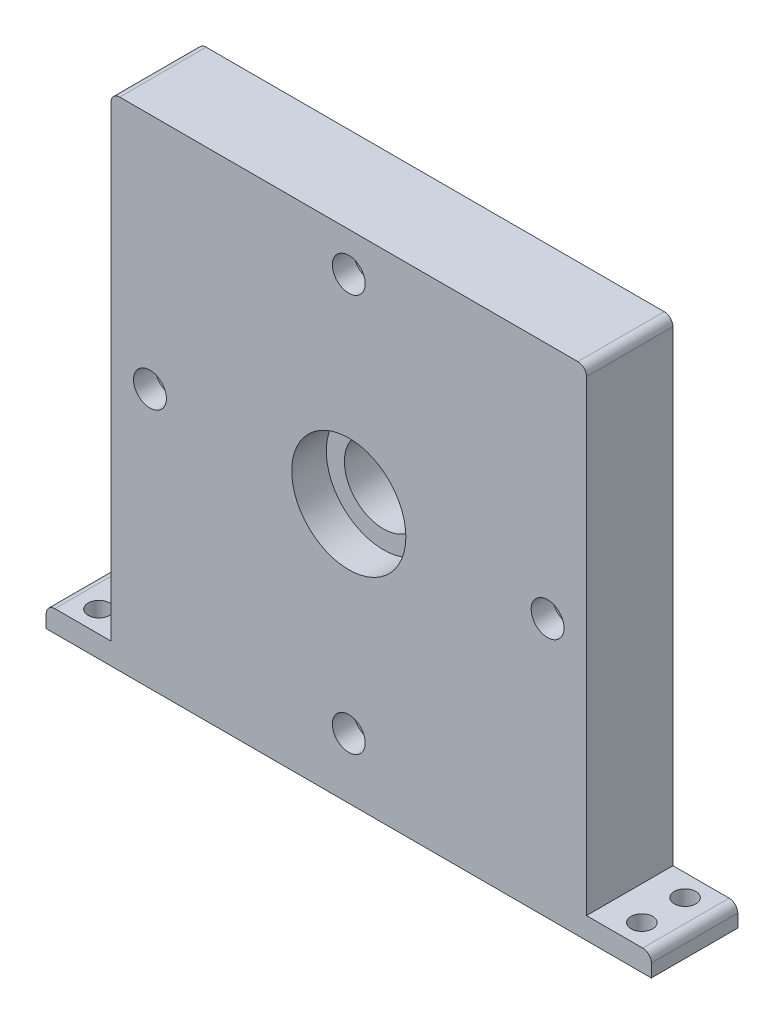
ISO-10303-21;
HEADER;
FILE_DESCRIPTION(('STEP AP214'),'2;1');
FILE_NAME('part.step','',(''),(''),'','','');
FILE_SCHEMA(('AUTOMOTIVE_DESIGN { 1 0 10303 214 1 1 1 1 }'));
ENDSEC;
DATA;
#1=APPLICATION_CONTEXT('core data for automotive mechanical design processes');
#2=APPLICATION_PROTOCOL_DEFINITION('international standard','automotive_design',2000,#1);
#3=PRODUCT_CONTEXT('',#1,'mechanical');
#4=PRODUCT('Part','Part','',(#3));
#5=PRODUCT_RELATED_PRODUCT_CATEGORY('part','',(#4));
#6=PRODUCT_DEFINITION_FORMATION('','',#4);
#7=PRODUCT_DEFINITION_CONTEXT('part definition',#1,'design');
#8=PRODUCT_DEFINITION('design','',#6,#7);
#9=PRODUCT_DEFINITION_SHAPE('','',#8);
#10=(LENGTH_UNIT() NAMED_UNIT(*) SI_UNIT(.MILLI.,.METRE.));
#11=(NAMED_UNIT(*) PLANE_ANGLE_UNIT() SI_UNIT($,.RADIAN.));
#12=(NAMED_UNIT(*) SI_UNIT($,.STERADIAN.) SOLID_ANGLE_UNIT());
#13=UNCERTAINTY_MEASURE_WITH_UNIT(LENGTH_MEASURE(1.E-05),#10,'distance_accuracy_value','');
#14=(GEOMETRIC_REPRESENTATION_CONTEXT(3) GLOBAL_UNCERTAINTY_ASSIGNED_CONTEXT((#13)) GLOBAL_UNIT_ASSIGNED_CONTEXT((#10,
#11,#12)) REPRESENTATION_CONTEXT('',''));
#15=CARTESIAN_POINT('',(0.,0.,0.));
#16=DIRECTION('',(0.,0.,1.));
#17=DIRECTION('',(1.,0.,0.));
#18=AXIS2_PLACEMENT_3D('',#15,#16,#17);
#19=CARTESIAN_POINT('',(69.8500000000003,17.78,-25.4));
#20=DIRECTION('',(0.,0.,1.));
#21=DIRECTION('',(1.,0.,0.));
#22=AXIS2_PLACEMENT_3D('',#19,#20,#21);
#23=CYLINDRICAL_SURFACE('',#22,3.37820000000001);
#24=CARTESIAN_POINT('',(69.8500000000003,17.78,-25.4));
#25=DIRECTION('',(0.,0.,1.));
#26=DIRECTION('',(1.,0.,0.));
#27=AXIS2_PLACEMENT_3D('',#24,#25,#26);
#28=CIRCLE('',#27,3.37820000000001);
#29=CARTESIAN_POINT('',(73.2282000000003,17.78,-25.4));
#30=VERTEX_POINT('',#29);
#31=EDGE_CURVE('E263',#30,#30,#28,.T.);
#32=ORIENTED_EDGE('',*,*,#31,.F.);
#33=EDGE_LOOP('',(#32));
#34=FACE_BOUND('',#33,.T.);
#35=CARTESIAN_POINT('',(69.8500000000003,17.78,-6.35));
#36=DIRECTION('',(0.,0.,1.));
#37=DIRECTION('',(1.,0.,0.));
#38=AXIS2_PLACEMENT_3D('',#35,#36,#37);
#39=CIRCLE('',#38,3.37820000000001);
#40=CARTESIAN_POINT('',(73.2282000000003,17.78,-6.35));
#41=VERTEX_POINT('',#40);
#42=EDGE_CURVE('E41',#41,#41,#39,.F.);
#43=ORIENTED_EDGE('',*,*,#42,.F.);
#44=EDGE_LOOP('',(#43));
#45=FACE_BOUND('',#44,.T.);
#46=ADVANCED_FACE('F37',(#34,#45),#23,.F.);
#47=CARTESIAN_POINT('',(128.27,76.2000000000002,-25.4));
#48=DIRECTION('',(0.,0.,1.));
#49=DIRECTION('',(1.,0.,0.));
#50=AXIS2_PLACEMENT_3D('',#47,#48,#49);
#51=CYLINDRICAL_SURFACE('',#50,3.37819999999999);
#52=CARTESIAN_POINT('',(128.27,76.2000000000002,-25.4));
#53=DIRECTION('',(0.,0.,1.));
#54=DIRECTION('',(1.,0.,0.));
#55=AXIS2_PLACEMENT_3D('',#52,#53,#54);
#56=CIRCLE('',#55,3.37819999999999);
#57=CARTESIAN_POINT('',(131.6482,76.2000000000002,-25.4));
#58=VERTEX_POINT('',#57);
#59=EDGE_CURVE('E267',#58,#58,#56,.T.);
#60=ORIENTED_EDGE('',*,*,#59,.F.);
#61=EDGE_LOOP('',(#60));
#62=FACE_BOUND('',#61,.T.);
#63=CARTESIAN_POINT('',(128.27,76.2000000000002,-6.35));
#64=DIRECTION('',(0.,0.,1.));
#65=DIRECTION('',(1.,0.,0.));
#66=AXIS2_PLACEMENT_3D('',#63,#64,#65);
#67=CIRCLE('',#66,3.37819999999999);
#68=CARTESIAN_POINT('',(131.6482,76.2000000000002,-6.35));
#69=VERTEX_POINT('',#68);
#70=EDGE_CURVE('E258',#69,#69,#67,.F.);
#71=ORIENTED_EDGE('',*,*,#70,.F.);
#72=EDGE_LOOP('',(#71));
#73=FACE_BOUND('',#72,.T.);
#74=ADVANCED_FACE('F304',(#62,#73),#51,.F.);
#75=CARTESIAN_POINT('',(69.8499999999998,134.62,-25.4));
#76=DIRECTION('',(0.,0.,1.));
#77=DIRECTION('',(1.,0.,0.));
#78=AXIS2_PLACEMENT_3D('',#75,#76,#77);
#79=CYLINDRICAL_SURFACE('',#78,3.3782);
#80=CARTESIAN_POINT('',(69.8499999999998,134.62,-25.4));
#81=DIRECTION('',(0.,0.,1.));
#82=DIRECTION('',(1.,0.,0.));
#83=AXIS2_PLACEMENT_3D('',#80,#81,#82);
#84=CIRCLE('',#83,3.3782);
#85=CARTESIAN_POINT('',(73.2281999999998,134.62,-25.4));
#86=VERTEX_POINT('',#85);
#87=EDGE_CURVE('E272',#86,#86,#84,.T.);
#88=ORIENTED_EDGE('',*,*,#87,.F.);
#89=EDGE_LOOP('',(#88));
#90=FACE_BOUND('',#89,.T.);
#91=CARTESIAN_POINT('',(69.8499999999998,134.62,-6.35));
#92=DIRECTION('',(0.,0.,1.));
#93=DIRECTION('',(1.,0.,0.));
#94=AXIS2_PLACEMENT_3D('',#91,#92,#93);
#95=CIRCLE('',#94,3.3782);
#96=CARTESIAN_POINT('',(73.2281999999998,134.62,-6.35));
#97=VERTEX_POINT('',#96);
#98=EDGE_CURVE('E255',#97,#97,#95,.F.);
#99=ORIENTED_EDGE('',*,*,#98,.F.);
#100=EDGE_LOOP('',(#99));
#101=FACE_BOUND('',#100,.T.);
#102=ADVANCED_FACE('F310',(#90,#101),#79,.F.);
#103=CARTESIAN_POINT('',(11.43,76.1999999999998,-25.4));
#104=DIRECTION('',(0.,0.,1.));
#105=DIRECTION('',(1.,0.,0.));
#106=AXIS2_PLACEMENT_3D('',#103,#104,#105);
#107=CYLINDRICAL_SURFACE('',#106,3.37820000000002);
#108=CARTESIAN_POINT('',(11.43,76.1999999999998,-25.4));
#109=DIRECTION('',(0.,0.,1.));
#110=DIRECTION('',(1.,0.,0.));
#111=AXIS2_PLACEMENT_3D('',#108,#109,#110);
#112=CIRCLE('',#111,3.37820000000002);
#113=CARTESIAN_POINT('',(14.8082000000001,76.1999999999998,-25.4));
#114=VERTEX_POINT('',#113);
#115=EDGE_CURVE('E281',#114,#114,#112,.T.);
#116=ORIENTED_EDGE('',*,*,#115,.F.);
#117=EDGE_LOOP('',(#116));
#118=FACE_BOUND('',#117,.T.);
#119=CARTESIAN_POINT('',(11.43,76.1999999999998,-6.35));
#120=DIRECTION('',(0.,0.,1.));
#121=DIRECTION('',(1.,0.,0.));
#122=AXIS2_PLACEMENT_3D('',#119,#120,#121);
#123=CIRCLE('',#122,3.37820000000002);
#124=CARTESIAN_POINT('',(14.8082000000001,76.1999999999998,-6.35));
#125=VERTEX_POINT('',#124);
#126=EDGE_CURVE('E252',#125,#125,#123,.F.);
#127=ORIENTED_EDGE('',*,*,#126,.F.);
#128=EDGE_LOOP('',(#127));
#129=FACE_BOUND('',#128,.T.);
#130=ADVANCED_FACE('F317',(#118,#129),#107,.F.);
#131=CARTESIAN_POINT('',(0.,146.05,0.));
#132=DIRECTION('',(1.,0.,0.));
#133=DIRECTION('',(0.,0.,-1.));
#134=AXIS2_PLACEMENT_3D('',#131,#132,#133);
#135=PLANE('',#134);
#136=DIRECTION('',(0.,-1.,0.));
#137=VECTOR('',#136,1.);
#138=CARTESIAN_POINT('',(0.,146.05,0.));
#139=LINE('',#138,#137);
#140=CARTESIAN_POINT('',(0.,143.51,0.));
#141=VERTEX_POINT('',#140);
#142=CARTESIAN_POINT('',(0.,6.34999999999999,0.));
#143=VERTEX_POINT('',#142);
#144=EDGE_CURVE('E232',#141,#143,#139,.T.);
#145=ORIENTED_EDGE('',*,*,#144,.F.);
#146=DIRECTION('',(0.,0.,1.));
#147=VECTOR('',#146,1.);
#148=CARTESIAN_POINT('',(0.,143.51,0.));
#149=LINE('',#148,#147);
#150=CARTESIAN_POINT('',(0.,143.51,-25.4));
#151=VERTEX_POINT('',#150);
#152=EDGE_CURVE('E12',#141,#151,#149,.F.);
#153=ORIENTED_EDGE('',*,*,#152,.T.);
#154=DIRECTION('',(0.,1.,0.));
#155=VECTOR('',#154,1.);
#156=CARTESIAN_POINT('',(0.,6.34999999999999,-25.4));
#157=LINE('',#156,#155);
#158=CARTESIAN_POINT('',(0.,6.34999999999999,-25.4));
#159=VERTEX_POINT('',#158);
#160=EDGE_CURVE('E179',#159,#151,#157,.T.);
#161=ORIENTED_EDGE('',*,*,#160,.F.);
#162=DIRECTION('',(0.,0.,-1.));
#163=VECTOR('',#162,1.);
#164=CARTESIAN_POINT('',(0.,6.35,0.));
#165=LINE('',#164,#163);
#166=EDGE_CURVE('E216',#143,#159,#165,.T.);
#167=ORIENTED_EDGE('',*,*,#166,.F.);
#168=EDGE_LOOP('',(#145,#153,#161,#167));
#169=FACE_BOUND('',#168,.T.);
#170=ADVANCED_FACE('F321',(#169),#135,.F.);
#171=CARTESIAN_POINT('',(0.,146.05,0.));
#172=DIRECTION('',(0.,0.,-1.));
#173=DIRECTION('',(-1.,0.,0.));
#174=AXIS2_PLACEMENT_3D('',#171,#172,#173);
#175=PLANE('',#174);
#176=CARTESIAN_POINT('',(11.43,76.1999999999998,0.));
#177=DIRECTION('',(0.,0.,1.));
#178=DIRECTION('',(1.,0.,0.));
#179=AXIS2_PLACEMENT_3D('',#176,#177,#178);
#180=CIRCLE('',#179,4.826);
#181=CARTESIAN_POINT('',(16.256,76.1999999999998,0.));
#182=VERTEX_POINT('',#181);
#183=EDGE_CURVE('E360',#182,#182,#180,.T.);
#184=ORIENTED_EDGE('',*,*,#183,.F.);
#185=EDGE_LOOP('',(#184));
#186=FACE_BOUND('',#185,.T.);
#187=CARTESIAN_POINT('',(69.8499999999998,134.62,0.));
#188=DIRECTION('',(0.,0.,1.));
#189=DIRECTION('',(1.,0.,0.));
#190=AXIS2_PLACEMENT_3D('',#187,#188,#189);
#191=CIRCLE('',#190,4.82599999999999);
#192=CARTESIAN_POINT('',(74.6759999999998,134.62,0.));
#193=VERTEX_POINT('',#192);
#194=EDGE_CURVE('E370',#193,#193,#191,.T.);
#195=ORIENTED_EDGE('',*,*,#194,.F.);
#196=EDGE_LOOP('',(#195));
#197=FACE_BOUND('',#196,.T.);
#198=CARTESIAN_POINT('',(128.27,76.2000000000002,0.));
#199=DIRECTION('',(0.,0.,1.));
#200=DIRECTION('',(1.,0.,0.));
#201=AXIS2_PLACEMENT_3D('',#198,#199,#200);
#202=CIRCLE('',#201,4.82599999999999);
#203=CARTESIAN_POINT('',(133.096,76.2000000000002,0.));
#204=VERTEX_POINT('',#203);
#205=EDGE_CURVE('E376',#204,#204,#202,.T.);
#206=ORIENTED_EDGE('',*,*,#205,.F.);
#207=EDGE_LOOP('',(#206));
#208=FACE_BOUND('',#207,.T.);
#209=CARTESIAN_POINT('',(69.8500000000003,17.78,0.));
#210=DIRECTION('',(0.,0.,1.));
#211=DIRECTION('',(1.,0.,0.));
#212=AXIS2_PLACEMENT_3D('',#209,#210,#211);
#213=CIRCLE('',#212,4.82599999999999);
#214=CARTESIAN_POINT('',(74.6760000000002,17.78,0.));
#215=VERTEX_POINT('',#214);
#216=EDGE_CURVE('E382',#215,#215,#213,.T.);
#217=ORIENTED_EDGE('',*,*,#216,.F.);
#218=EDGE_LOOP('',(#217));
#219=FACE_BOUND('',#218,.T.);
#220=CARTESIAN_POINT('',(69.85,76.2,0.));
#221=DIRECTION('',(0.,0.,1.));
#222=DIRECTION('',(1.,0.,0.));
#223=AXIS2_PLACEMENT_3D('',#220,#221,#222);
#224=CIRCLE('',#223,16.764);
#225=CARTESIAN_POINT('',(86.614,76.2,0.));
#226=VERTEX_POINT('',#225);
#227=EDGE_CURVE('E188',#226,#226,#224,.T.);
#228=ORIENTED_EDGE('',*,*,#227,.F.);
#229=EDGE_LOOP('',(#228));
#230=FACE_BOUND('',#229,.T.);
#231=DIRECTION('',(0.,1.,0.));
#232=VECTOR('',#231,1.);
#233=CARTESIAN_POINT('',(158.75,0.,0.));
#234=LINE('',#233,#232);
#235=CARTESIAN_POINT('',(158.75,0.,0.));
#236=VERTEX_POINT('',#235);
#237=CARTESIAN_POINT('',(158.75,3.81,0.));
#238=VERTEX_POINT('',#237);
#239=EDGE_CURVE('E206',#236,#238,#234,.T.);
#240=ORIENTED_EDGE('',*,*,#239,.T.);
#241=CARTESIAN_POINT('',(156.21,3.81,0.));
#242=DIRECTION('',(0.,0.,-1.));
#243=DIRECTION('',(-1.,0.,0.));
#244=AXIS2_PLACEMENT_3D('',#241,#242,#243);
#245=CIRCLE('',#244,2.54);
#246=CARTESIAN_POINT('',(156.21,6.35,0.));
#247=VERTEX_POINT('',#246);
#248=EDGE_CURVE('E243',#238,#247,#245,.F.);
#249=ORIENTED_EDGE('',*,*,#248,.T.);
#250=DIRECTION('',(-1.,0.,0.));
#251=VECTOR('',#250,1.);
#252=CARTESIAN_POINT('',(158.75,6.35,0.));
#253=LINE('',#252,#251);
#254=CARTESIAN_POINT('',(139.7,6.35,0.));
#255=VERTEX_POINT('',#254);
#256=EDGE_CURVE('E212',#247,#255,#253,.T.);
#257=ORIENTED_EDGE('',*,*,#256,.T.);
#258=DIRECTION('',(0.,-1.,0.));
#259=VECTOR('',#258,1.);
#260=CARTESIAN_POINT('',(139.7,146.05,0.));
#261=LINE('',#260,#259);
#262=CARTESIAN_POINT('',(139.7,143.51,0.));
#263=VERTEX_POINT('',#262);
#264=EDGE_CURVE('E229',#263,#255,#261,.T.);
#265=ORIENTED_EDGE('',*,*,#264,.F.);
#266=CARTESIAN_POINT('',(137.16,143.51,0.));
#267=DIRECTION('',(0.,0.,-1.));
#268=DIRECTION('',(-1.,0.,0.));
#269=AXIS2_PLACEMENT_3D('',#266,#267,#268);
#270=CIRCLE('',#269,2.54);
#271=CARTESIAN_POINT('',(137.16,146.05,0.));
#272=VERTEX_POINT('',#271);
#273=EDGE_CURVE('E133',#263,#272,#270,.F.);
#274=ORIENTED_EDGE('',*,*,#273,.T.);
#275=DIRECTION('',(1.,0.,0.));
#276=VECTOR('',#275,1.);
#277=CARTESIAN_POINT('',(0.,146.05,0.));
#278=LINE('',#277,#276);
#279=CARTESIAN_POINT('',(2.54,146.05,0.));
#280=VERTEX_POINT('',#279);
#281=EDGE_CURVE('E226',#280,#272,#278,.T.);
#282=ORIENTED_EDGE('',*,*,#281,.F.);
#283=CARTESIAN_POINT('',(2.54,143.51,0.));
#284=DIRECTION('',(0.,0.,-1.));
#285=DIRECTION('',(-1.,0.,0.));
#286=AXIS2_PLACEMENT_3D('',#283,#284,#285);
#287=CIRCLE('',#286,2.54);
#288=EDGE_CURVE('E239',#280,#141,#287,.F.);
#289=ORIENTED_EDGE('',*,*,#288,.T.);
#290=ORIENTED_EDGE('',*,*,#144,.T.);
#291=DIRECTION('',(1.,0.,0.));
#292=VECTOR('',#291,1.);
#293=CARTESIAN_POINT('',(-19.05,6.35,0.));
#294=LINE('',#293,#292);
#295=CARTESIAN_POINT('',(-16.51,6.35,0.));
#296=VERTEX_POINT('',#295);
#297=EDGE_CURVE('E222',#296,#143,#294,.T.);
#298=ORIENTED_EDGE('',*,*,#297,.F.);
#299=CARTESIAN_POINT('',(-16.51,3.81,0.));
#300=DIRECTION('',(0.,0.,-1.));
#301=DIRECTION('',(-1.,0.,0.));
#302=AXIS2_PLACEMENT_3D('',#299,#300,#301);
#303=CIRCLE('',#302,2.54);
#304=CARTESIAN_POINT('',(-19.05,3.81,0.));
#305=VERTEX_POINT('',#304);
#306=EDGE_CURVE('E54',#296,#305,#303,.F.);
#307=ORIENTED_EDGE('',*,*,#306,.T.);
#308=DIRECTION('',(0.,1.,0.));
#309=VECTOR('',#308,1.);
#310=CARTESIAN_POINT('',(-19.05,0.,0.));
#311=LINE('',#310,#309);
#312=CARTESIAN_POINT('',(-19.05,0.,0.));
#313=VERTEX_POINT('',#312);
#314=EDGE_CURVE('E217',#313,#305,#311,.T.);
#315=ORIENTED_EDGE('',*,*,#314,.F.);
#316=DIRECTION('',(1.,0.,0.));
#317=VECTOR('',#316,1.);
#318=CARTESIAN_POINT('',(0.,0.,0.));
#319=LINE('',#318,#317);
#320=EDGE_CURVE('E225',#313,#236,#319,.T.);
#321=ORIENTED_EDGE('',*,*,#320,.T.);
#322=EDGE_LOOP('',(#240,#249,#257,#265,#274,#282,#289,#290,#298,#307,#315,#321));
#323=FACE_BOUND('',#322,.T.);
#324=ADVANCED_FACE('F449',(#186,#197,#208,#219,#230,#323),#175,.F.);
#325=CARTESIAN_POINT('',(139.7,146.05,0.));
#326=DIRECTION('',(-1.,0.,0.));
#327=DIRECTION('',(0.,0.,1.));
#328=AXIS2_PLACEMENT_3D('',#325,#326,#327);
#329=PLANE('',#328);
#330=DIRECTION('',(0.,0.,-1.));
#331=VECTOR('',#330,1.);
#332=CARTESIAN_POINT('',(139.7,6.35,0.));
#333=LINE('',#332,#331);
#334=CARTESIAN_POINT('',(139.7,6.34999999999999,-25.4));
#335=VERTEX_POINT('',#334);
#336=EDGE_CURVE('E142',#255,#335,#333,.T.);
#337=ORIENTED_EDGE('',*,*,#336,.T.);
#338=DIRECTION('',(0.,-1.,0.));
#339=VECTOR('',#338,1.);
#340=CARTESIAN_POINT('',(139.7,143.51,-25.4));
#341=LINE('',#340,#339);
#342=CARTESIAN_POINT('',(139.7,143.51,-25.4));
#343=VERTEX_POINT('',#342);
#344=EDGE_CURVE('E139',#343,#335,#341,.T.);
#345=ORIENTED_EDGE('',*,*,#344,.F.);
#346=DIRECTION('',(0.,0.,-1.));
#347=VECTOR('',#346,1.);
#348=CARTESIAN_POINT('',(139.7,143.51,0.));
#349=LINE('',#348,#347);
#350=EDGE_CURVE('E46',#343,#263,#349,.F.);
#351=ORIENTED_EDGE('',*,*,#350,.T.);
#352=ORIENTED_EDGE('',*,*,#264,.T.);
#353=EDGE_LOOP('',(#337,#345,#351,#352));
#354=FACE_BOUND('',#353,.T.);
#355=ADVANCED_FACE('F140',(#354),#329,.F.);
#356=CARTESIAN_POINT('',(0.,146.05,0.));
#357=DIRECTION('',(0.,-1.,0.));
#358=DIRECTION('',(0.,0.,-1.));
#359=AXIS2_PLACEMENT_3D('',#356,#357,#358);
#360=PLANE('',#359);
#361=ORIENTED_EDGE('',*,*,#281,.T.);
#362=DIRECTION('',(0.,0.,-1.));
#363=VECTOR('',#362,1.);
#364=CARTESIAN_POINT('',(137.16,146.05,0.));
#365=LINE('',#364,#363);
#366=CARTESIAN_POINT('',(137.16,146.05,-25.4));
#367=VERTEX_POINT('',#366);
#368=EDGE_CURVE('E136',#272,#367,#365,.T.);
#369=ORIENTED_EDGE('',*,*,#368,.T.);
#370=DIRECTION('',(1.,0.,0.));
#371=VECTOR('',#370,1.);
#372=CARTESIAN_POINT('',(137.16,146.05,-25.4));
#373=LINE('',#372,#371);
#374=CARTESIAN_POINT('',(2.54,146.05,-25.4));
#375=VERTEX_POINT('',#374);
#376=EDGE_CURVE('E152',#375,#367,#373,.T.);
#377=ORIENTED_EDGE('',*,*,#376,.F.);
#378=DIRECTION('',(0.,0.,1.));
#379=VECTOR('',#378,1.);
#380=CARTESIAN_POINT('',(2.54,146.05,0.));
#381=LINE('',#380,#379);
#382=EDGE_CURVE('E248',#375,#280,#381,.T.);
#383=ORIENTED_EDGE('',*,*,#382,.T.);
#384=EDGE_LOOP('',(#361,#369,#377,#383));
#385=FACE_BOUND('',#384,.T.);
#386=ADVANCED_FACE('F440',(#385),#360,.F.);
#387=CARTESIAN_POINT('',(0.,0.,0.));
#388=DIRECTION('',(0.,-1.,0.));
#389=DIRECTION('',(0.,0.,-1.));
#390=AXIS2_PLACEMENT_3D('',#387,#388,#389);
#391=PLANE('',#390);
#392=CARTESIAN_POINT('',(149.606,0.,-19.05));
#393=DIRECTION('',(0.,-1.,0.));
#394=DIRECTION('',(0.,0.,-1.));
#395=AXIS2_PLACEMENT_3D('',#392,#393,#394);
#396=CIRCLE('',#395,3.175);
#397=CARTESIAN_POINT('',(149.606,0.,-22.225));
#398=VERTEX_POINT('',#397);
#399=EDGE_CURVE('E279',#398,#398,#396,.F.);
#400=ORIENTED_EDGE('',*,*,#399,.T.);
#401=EDGE_LOOP('',(#400));
#402=FACE_BOUND('',#401,.T.);
#403=CARTESIAN_POINT('',(-9.906,0.,-19.05));
#404=DIRECTION('',(0.,-1.,0.));
#405=DIRECTION('',(0.,0.,-1.));
#406=AXIS2_PLACEMENT_3D('',#403,#404,#405);
#407=CIRCLE('',#406,3.175);
#408=CARTESIAN_POINT('',(-9.906,0.,-22.225));
#409=VERTEX_POINT('',#408);
#410=EDGE_CURVE('E153',#409,#409,#407,.T.);
#411=ORIENTED_EDGE('',*,*,#410,.F.);
#412=EDGE_LOOP('',(#411));
#413=FACE_BOUND('',#412,.T.);
#414=CARTESIAN_POINT('',(149.606,0.,-6.35));
#415=DIRECTION('',(0.,-1.,0.));
#416=DIRECTION('',(0.,0.,-1.));
#417=AXIS2_PLACEMENT_3D('',#414,#415,#416);
#418=CIRCLE('',#417,3.175);
#419=CARTESIAN_POINT('',(149.606,0.,-9.525));
#420=VERTEX_POINT('',#419);
#421=EDGE_CURVE('E197',#420,#420,#418,.T.);
#422=ORIENTED_EDGE('',*,*,#421,.F.);
#423=EDGE_LOOP('',(#422));
#424=FACE_BOUND('',#423,.T.);
#425=CARTESIAN_POINT('',(-9.906,0.,-6.35));
#426=DIRECTION('',(0.,-1.,0.));
#427=DIRECTION('',(0.,0.,-1.));
#428=AXIS2_PLACEMENT_3D('',#425,#426,#427);
#429=CIRCLE('',#428,3.175);
#430=CARTESIAN_POINT('',(-9.906,0.,-9.525));
#431=VERTEX_POINT('',#430);
#432=EDGE_CURVE('E200',#431,#431,#429,.F.);
#433=ORIENTED_EDGE('',*,*,#432,.T.);
#434=EDGE_LOOP('',(#433));
#435=FACE_BOUND('',#434,.T.);
#436=ORIENTED_EDGE('',*,*,#320,.F.);
#437=DIRECTION('',(0.,0.,1.));
#438=VECTOR('',#437,1.);
#439=CARTESIAN_POINT('',(-19.05,0.,0.));
#440=LINE('',#439,#438);
#441=CARTESIAN_POINT('',(-19.05,0.,-25.4));
#442=VERTEX_POINT('',#441);
#443=EDGE_CURVE('E219',#442,#313,#440,.T.);
#444=ORIENTED_EDGE('',*,*,#443,.F.);
#445=DIRECTION('',(-1.,0.,0.));
#446=VECTOR('',#445,1.);
#447=CARTESIAN_POINT('',(158.75,0.,-25.4));
#448=LINE('',#447,#446);
#449=CARTESIAN_POINT('',(158.75,0.,-25.4));
#450=VERTEX_POINT('',#449);
#451=EDGE_CURVE('E167',#450,#442,#448,.T.);
#452=ORIENTED_EDGE('',*,*,#451,.F.);
#453=DIRECTION('',(0.,0.,1.));
#454=VECTOR('',#453,1.);
#455=CARTESIAN_POINT('',(158.75,0.,0.));
#456=LINE('',#455,#454);
#457=EDGE_CURVE('E209',#450,#236,#456,.T.);
#458=ORIENTED_EDGE('',*,*,#457,.T.);
#459=EDGE_LOOP('',(#436,#444,#452,#458));
#460=FACE_BOUND('',#459,.T.);
#461=ADVANCED_FACE('F439',(#402,#413,#424,#435,#460),#391,.T.);
#462=CARTESIAN_POINT('',(-19.05,6.35,0.));
#463=DIRECTION('',(0.,-1.,0.));
#464=DIRECTION('',(0.,0.,-1.));
#465=AXIS2_PLACEMENT_3D('',#462,#463,#464);
#466=PLANE('',#465);
#467=CARTESIAN_POINT('',(-9.906,6.35,-19.05));
#468=DIRECTION('',(0.,-1.,0.));
#469=DIRECTION('',(0.,0.,-1.));
#470=AXIS2_PLACEMENT_3D('',#467,#468,#469);
#471=CIRCLE('',#470,3.175);
#472=CARTESIAN_POINT('',(-9.906,6.35,-22.225));
#473=VERTEX_POINT('',#472);
#474=EDGE_CURVE('E156',#473,#473,#471,.T.);
#475=ORIENTED_EDGE('',*,*,#474,.T.);
#476=EDGE_LOOP('',(#475));
#477=FACE_BOUND('',#476,.T.);
#478=CARTESIAN_POINT('',(-9.906,6.35,-6.35));
#479=DIRECTION('',(0.,1.,0.));
#480=DIRECTION('',(0.,0.,1.));
#481=AXIS2_PLACEMENT_3D('',#478,#479,#480);
#482=CIRCLE('',#481,3.175);
#483=CARTESIAN_POINT('',(-9.906,6.35,-3.175));
#484=VERTEX_POINT('',#483);
#485=EDGE_CURVE('E201',#484,#484,#482,.T.);
#486=ORIENTED_EDGE('',*,*,#485,.F.);
#487=EDGE_LOOP('',(#486));
#488=FACE_BOUND('',#487,.T.);
#489=ORIENTED_EDGE('',*,*,#166,.T.);
#490=DIRECTION('',(1.,0.,0.));
#491=VECTOR('',#490,1.);
#492=CARTESIAN_POINT('',(-16.51,6.34999999999999,-25.4));
#493=LINE('',#492,#491);
#494=CARTESIAN_POINT('',(-16.51,6.34999999999999,-25.4));
#495=VERTEX_POINT('',#494);
#496=EDGE_CURVE('E176',#495,#159,#493,.T.);
#497=ORIENTED_EDGE('',*,*,#496,.F.);
#498=DIRECTION('',(0.,0.,-1.));
#499=VECTOR('',#498,1.);
#500=CARTESIAN_POINT('',(-16.51,6.35,0.));
#501=LINE('',#500,#499);
#502=EDGE_CURVE('E62',#495,#296,#501,.F.);
#503=ORIENTED_EDGE('',*,*,#502,.T.);
#504=ORIENTED_EDGE('',*,*,#297,.T.);
#505=EDGE_LOOP('',(#489,#497,#503,#504));
#506=FACE_BOUND('',#505,.T.);
#507=ADVANCED_FACE('F285',(#477,#488,#506),#466,.F.);
#508=CARTESIAN_POINT('',(-19.05,0.,0.));
#509=DIRECTION('',(-1.,0.,0.));
#510=DIRECTION('',(0.,0.,1.));
#511=AXIS2_PLACEMENT_3D('',#508,#509,#510);
#512=PLANE('',#511);
#513=ORIENTED_EDGE('',*,*,#314,.T.);
#514=DIRECTION('',(0.,0.,-1.));
#515=VECTOR('',#514,1.);
#516=CARTESIAN_POINT('',(-19.05,3.80999999999999,-12.7));
#517=LINE('',#516,#515);
#518=CARTESIAN_POINT('',(-19.05,3.80999999999999,-25.4));
#519=VERTEX_POINT('',#518);
#520=EDGE_CURVE('E245',#305,#519,#517,.T.);
#521=ORIENTED_EDGE('',*,*,#520,.T.);
#522=DIRECTION('',(0.,1.,0.));
#523=VECTOR('',#522,1.);
#524=CARTESIAN_POINT('',(-19.05,0.,-25.4));
#525=LINE('',#524,#523);
#526=EDGE_CURVE('E170',#442,#519,#525,.T.);
#527=ORIENTED_EDGE('',*,*,#526,.F.);
#528=ORIENTED_EDGE('',*,*,#443,.T.);
#529=EDGE_LOOP('',(#513,#521,#527,#528));
#530=FACE_BOUND('',#529,.T.);
#531=ADVANCED_FACE('F432',(#530),#512,.T.);
#532=CARTESIAN_POINT('',(158.75,6.35,0.));
#533=DIRECTION('',(0.,1.,0.));
#534=DIRECTION('',(0.,0.,1.));
#535=AXIS2_PLACEMENT_3D('',#532,#533,#534);
#536=PLANE('',#535);
#537=CARTESIAN_POINT('',(149.606,6.35,-19.05));
#538=DIRECTION('',(0.,1.,0.));
#539=DIRECTION('',(0.,0.,-1.));
#540=AXIS2_PLACEMENT_3D('',#537,#538,#539);
#541=CIRCLE('',#540,3.175);
#542=CARTESIAN_POINT('',(149.606,6.35,-22.225));
#543=VERTEX_POINT('',#542);
#544=EDGE_CURVE('E276',#543,#543,#541,.T.);
#545=ORIENTED_EDGE('',*,*,#544,.F.);
#546=EDGE_LOOP('',(#545));
#547=FACE_BOUND('',#546,.T.);
#548=CARTESIAN_POINT('',(149.606,6.35,-6.35));
#549=DIRECTION('',(0.,-1.,0.));
#550=DIRECTION('',(0.,0.,1.));
#551=AXIS2_PLACEMENT_3D('',#548,#549,#550);
#552=CIRCLE('',#551,3.175);
#553=CARTESIAN_POINT('',(149.606,6.35,-3.175));
#554=VERTEX_POINT('',#553);
#555=EDGE_CURVE('E194',#554,#554,#552,.T.);
#556=ORIENTED_EDGE('',*,*,#555,.T.);
#557=EDGE_LOOP('',(#556));
#558=FACE_BOUND('',#557,.T.);
#559=ORIENTED_EDGE('',*,*,#256,.F.);
#560=DIRECTION('',(0.,0.,-1.));
#561=VECTOR('',#560,1.);
#562=CARTESIAN_POINT('',(156.21,6.35,0.));
#563=LINE('',#562,#561);
#564=CARTESIAN_POINT('',(156.21,6.34999999999999,-25.4));
#565=VERTEX_POINT('',#564);
#566=EDGE_CURVE('E235',#247,#565,#563,.T.);
#567=ORIENTED_EDGE('',*,*,#566,.T.);
#568=DIRECTION('',(1.,0.,0.));
#569=VECTOR('',#568,1.);
#570=CARTESIAN_POINT('',(139.7,6.34999999999999,-25.4));
#571=LINE('',#570,#569);
#572=EDGE_CURVE('E146',#335,#565,#571,.T.);
#573=ORIENTED_EDGE('',*,*,#572,.F.);
#574=ORIENTED_EDGE('',*,*,#336,.F.);
#575=EDGE_LOOP('',(#559,#567,#573,#574));
#576=FACE_BOUND('',#575,.T.);
#577=ADVANCED_FACE('F428',(#547,#558,#576),#536,.T.);
#578=CARTESIAN_POINT('',(158.75,0.,0.));
#579=DIRECTION('',(1.,0.,0.));
#580=DIRECTION('',(0.,0.,1.));
#581=AXIS2_PLACEMENT_3D('',#578,#579,#580);
#582=PLANE('',#581);
#583=ORIENTED_EDGE('',*,*,#457,.F.);
#584=DIRECTION('',(0.,-1.,0.));
#585=VECTOR('',#584,1.);
#586=CARTESIAN_POINT('',(158.75,3.80999999999999,-25.4));
#587=LINE('',#586,#585);
#588=CARTESIAN_POINT('',(158.75,3.81,-25.4));
#589=VERTEX_POINT('',#588);
#590=EDGE_CURVE('E164',#589,#450,#587,.T.);
#591=ORIENTED_EDGE('',*,*,#590,.F.);
#592=DIRECTION('',(0.,0.,-1.));
#593=VECTOR('',#592,1.);
#594=CARTESIAN_POINT('',(158.75,3.81,0.));
#595=LINE('',#594,#593);
#596=EDGE_CURVE('E237',#589,#238,#595,.F.);
#597=ORIENTED_EDGE('',*,*,#596,.T.);
#598=ORIENTED_EDGE('',*,*,#239,.F.);
#599=EDGE_LOOP('',(#583,#591,#597,#598));
#600=FACE_BOUND('',#599,.T.);
#601=ADVANCED_FACE('F424',(#600),#582,.T.);
#602=CARTESIAN_POINT('',(-9.906,-0.0010000000000036,-6.35));
#603=DIRECTION('',(0.,1.,0.));
#604=DIRECTION('',(0.,0.,1.));
#605=AXIS2_PLACEMENT_3D('',#602,#603,#604);
#606=CYLINDRICAL_SURFACE('',#605,3.175);
#607=ORIENTED_EDGE('',*,*,#432,.F.);
#608=EDGE_LOOP('',(#607));
#609=FACE_BOUND('',#608,.T.);
#610=ORIENTED_EDGE('',*,*,#485,.T.);
#611=EDGE_LOOP('',(#610));
#612=FACE_BOUND('',#611,.T.);
#613=ADVANCED_FACE('F420',(#609,#612),#606,.F.);
#614=CARTESIAN_POINT('',(149.606,-0.0010000000000036,-6.35));
#615=DIRECTION('',(0.,1.,0.));
#616=DIRECTION('',(0.,0.,1.));
#617=AXIS2_PLACEMENT_3D('',#614,#615,#616);
#618=CYLINDRICAL_SURFACE('',#617,3.175);
#619=ORIENTED_EDGE('',*,*,#421,.T.);
#620=EDGE_LOOP('',(#619));
#621=FACE_BOUND('',#620,.T.);
#622=ORIENTED_EDGE('',*,*,#555,.F.);
#623=EDGE_LOOP('',(#622));
#624=FACE_BOUND('',#623,.T.);
#625=ADVANCED_FACE('F416',(#621,#624),#618,.F.);
#626=CARTESIAN_POINT('',(156.21,3.81,0.));
#627=DIRECTION('',(0.,0.,-1.));
#628=DIRECTION('',(0.,1.,0.));
#629=AXIS2_PLACEMENT_3D('',#626,#627,#628);
#630=CYLINDRICAL_SURFACE('',#629,2.54);
#631=ORIENTED_EDGE('',*,*,#248,.F.);
#632=ORIENTED_EDGE('',*,*,#596,.F.);
#633=CARTESIAN_POINT('',(156.21,3.81000000000001,-25.4));
#634=DIRECTION('',(0.,0.,-1.));
#635=DIRECTION('',(1.,0.,0.));
#636=AXIS2_PLACEMENT_3D('',#633,#634,#635);
#637=CIRCLE('',#636,2.53999999999999);
#638=EDGE_CURVE('E161',#565,#589,#637,.T.);
#639=ORIENTED_EDGE('',*,*,#638,.F.);
#640=ORIENTED_EDGE('',*,*,#566,.F.);
#641=EDGE_LOOP('',(#631,#632,#639,#640));
#642=FACE_BOUND('',#641,.T.);
#643=ADVANCED_FACE('F419',(#642),#630,.T.);
#644=CARTESIAN_POINT('',(-16.51,3.81,0.));
#645=DIRECTION('',(0.,0.,1.));
#646=DIRECTION('',(0.,-1.,0.));
#647=AXIS2_PLACEMENT_3D('',#644,#645,#646);
#648=CYLINDRICAL_SURFACE('',#647,2.54);
#649=ORIENTED_EDGE('',*,*,#306,.F.);
#650=ORIENTED_EDGE('',*,*,#502,.F.);
#651=CARTESIAN_POINT('',(-16.51,3.80999999999998,-25.4));
#652=DIRECTION('',(0.,0.,-1.));
#653=DIRECTION('',(1.,0.,0.));
#654=AXIS2_PLACEMENT_3D('',#651,#652,#653);
#655=CIRCLE('',#654,2.54000000000001);
#656=EDGE_CURVE('E173',#519,#495,#655,.T.);
#657=ORIENTED_EDGE('',*,*,#656,.F.);
#658=ORIENTED_EDGE('',*,*,#520,.F.);
#659=EDGE_LOOP('',(#649,#650,#657,#658));
#660=FACE_BOUND('',#659,.T.);
#661=ADVANCED_FACE('F458',(#660),#648,.T.);
#662=CARTESIAN_POINT('',(137.16,143.51,0.));
#663=DIRECTION('',(0.,0.,-1.));
#664=DIRECTION('',(-1.,0.,0.));
#665=AXIS2_PLACEMENT_3D('',#662,#663,#664);
#666=CYLINDRICAL_SURFACE('',#665,2.54);
#667=ORIENTED_EDGE('',*,*,#273,.F.);
#668=ORIENTED_EDGE('',*,*,#350,.F.);
#669=CARTESIAN_POINT('',(137.16,143.51,-25.4));
#670=DIRECTION('',(0.,0.,-1.));
#671=DIRECTION('',(1.,0.,0.));
#672=AXIS2_PLACEMENT_3D('',#669,#670,#671);
#673=CIRCLE('',#672,2.53999999999999);
#674=EDGE_CURVE('E132',#367,#343,#673,.T.);
#675=ORIENTED_EDGE('',*,*,#674,.F.);
#676=ORIENTED_EDGE('',*,*,#368,.F.);
#677=EDGE_LOOP('',(#667,#668,#675,#676));
#678=FACE_BOUND('',#677,.T.);
#679=ADVANCED_FACE('F129',(#678),#666,.T.);
#680=CARTESIAN_POINT('',(2.54,143.51,0.));
#681=DIRECTION('',(0.,0.,1.));
#682=DIRECTION('',(1.,0.,0.));
#683=AXIS2_PLACEMENT_3D('',#680,#681,#682);
#684=CYLINDRICAL_SURFACE('',#683,2.54);
#685=ORIENTED_EDGE('',*,*,#382,.F.);
#686=CARTESIAN_POINT('',(2.54,143.51,-25.4));
#687=DIRECTION('',(0.,0.,-1.));
#688=DIRECTION('',(1.,0.,0.));
#689=AXIS2_PLACEMENT_3D('',#686,#687,#688);
#690=CIRCLE('',#689,2.53999999999999);
#691=EDGE_CURVE('E182',#151,#375,#690,.T.);
#692=ORIENTED_EDGE('',*,*,#691,.F.);
#693=ORIENTED_EDGE('',*,*,#152,.F.);
#694=ORIENTED_EDGE('',*,*,#288,.F.);
#695=EDGE_LOOP('',(#685,#692,#693,#694));
#696=FACE_BOUND('',#695,.T.);
#697=ADVANCED_FACE('F39',(#696),#684,.T.);
#698=CARTESIAN_POINT('',(69.85,76.2,-60.1157523192451));
#699=DIRECTION('',(0.,0.,1.));
#700=DIRECTION('',(1.,0.,0.));
#701=AXIS2_PLACEMENT_3D('',#698,#699,#700);
#702=CYLINDRICAL_SURFACE('',#701,16.764);
#703=CARTESIAN_POINT('',(69.85,76.2,-10.16));
#704=DIRECTION('',(0.,0.,1.));
#705=DIRECTION('',(1.,0.,0.));
#706=AXIS2_PLACEMENT_3D('',#703,#704,#705);
#707=CIRCLE('',#706,16.764);
#708=CARTESIAN_POINT('',(86.614,76.2,-10.16));
#709=VERTEX_POINT('',#708);
#710=EDGE_CURVE('E191',#709,#709,#707,.F.);
#711=ORIENTED_EDGE('',*,*,#710,.T.);
#712=EDGE_LOOP('',(#711));
#713=FACE_BOUND('',#712,.T.);
#714=ORIENTED_EDGE('',*,*,#227,.T.);
#715=EDGE_LOOP('',(#714));
#716=FACE_BOUND('',#715,.T.);
#717=ADVANCED_FACE('F409',(#713,#716),#702,.F.);
#718=CARTESIAN_POINT('',(0.,146.05,-10.16));
#719=DIRECTION('',(0.,0.,1.));
#720=DIRECTION('',(1.,0.,0.));
#721=AXIS2_PLACEMENT_3D('',#718,#719,#720);
#722=PLANE('',#721);
#723=CARTESIAN_POINT('',(69.85,76.2,-10.16));
#724=DIRECTION('',(0.,0.,1.));
#725=DIRECTION('',(1.,0.,0.));
#726=AXIS2_PLACEMENT_3D('',#723,#724,#725);
#727=CIRCLE('',#726,11.4554);
#728=CARTESIAN_POINT('',(81.3054,76.2,-10.16));
#729=VERTEX_POINT('',#728);
#730=EDGE_CURVE('E185',#729,#729,#727,.T.);
#731=ORIENTED_EDGE('',*,*,#730,.F.);
#732=EDGE_LOOP('',(#731));
#733=FACE_BOUND('',#732,.T.);
#734=ORIENTED_EDGE('',*,*,#710,.F.);
#735=EDGE_LOOP('',(#734));
#736=FACE_BOUND('',#735,.T.);
#737=ADVANCED_FACE('F403',(#733,#736),#722,.T.);
#738=CARTESIAN_POINT('',(69.85,76.2,-12.7));
#739=DIRECTION('',(0.,0.,1.));
#740=DIRECTION('',(1.,0.,0.));
#741=AXIS2_PLACEMENT_3D('',#738,#739,#740);
#742=CYLINDRICAL_SURFACE('',#741,11.4554);
#743=ORIENTED_EDGE('',*,*,#730,.T.);
#744=EDGE_LOOP('',(#743));
#745=FACE_BOUND('',#744,.T.);
#746=CARTESIAN_POINT('',(69.85,76.2,-25.4));
#747=DIRECTION('',(0.,0.,1.));
#748=DIRECTION('',(1.,0.,0.));
#749=AXIS2_PLACEMENT_3D('',#746,#747,#748);
#750=CIRCLE('',#749,11.4554);
#751=CARTESIAN_POINT('',(81.3054,76.2,-25.4));
#752=VERTEX_POINT('',#751);
#753=EDGE_CURVE('E366',#752,#752,#750,.T.);
#754=ORIENTED_EDGE('',*,*,#753,.F.);
#755=EDGE_LOOP('',(#754));
#756=FACE_BOUND('',#755,.T.);
#757=ADVANCED_FACE('F300',(#745,#756),#742,.F.);
#758=CARTESIAN_POINT('',(137.16,143.51,-25.4));
#759=DIRECTION('',(0.,0.,1.));
#760=DIRECTION('',(1.,0.,0.));
#761=AXIS2_PLACEMENT_3D('',#758,#759,#760);
#762=PLANE('',#761);
#763=ORIENTED_EDGE('',*,*,#753,.T.);
#764=EDGE_LOOP('',(#763));
#765=FACE_BOUND('',#764,.T.);
#766=ORIENTED_EDGE('',*,*,#115,.T.);
#767=EDGE_LOOP('',(#766));
#768=FACE_BOUND('',#767,.T.);
#769=ORIENTED_EDGE('',*,*,#87,.T.);
#770=EDGE_LOOP('',(#769));
#771=FACE_BOUND('',#770,.T.);
#772=ORIENTED_EDGE('',*,*,#59,.T.);
#773=EDGE_LOOP('',(#772));
#774=FACE_BOUND('',#773,.T.);
#775=ORIENTED_EDGE('',*,*,#31,.T.);
#776=EDGE_LOOP('',(#775));
#777=FACE_BOUND('',#776,.T.);
#778=ORIENTED_EDGE('',*,*,#674,.T.);
#779=ORIENTED_EDGE('',*,*,#344,.T.);
#780=ORIENTED_EDGE('',*,*,#572,.T.);
#781=ORIENTED_EDGE('',*,*,#638,.T.);
#782=ORIENTED_EDGE('',*,*,#590,.T.);
#783=ORIENTED_EDGE('',*,*,#451,.T.);
#784=ORIENTED_EDGE('',*,*,#526,.T.);
#785=ORIENTED_EDGE('',*,*,#656,.T.);
#786=ORIENTED_EDGE('',*,*,#496,.T.);
#787=ORIENTED_EDGE('',*,*,#160,.T.);
#788=ORIENTED_EDGE('',*,*,#691,.T.);
#789=ORIENTED_EDGE('',*,*,#376,.T.);
#790=EDGE_LOOP('',(#778,#779,#780,#781,#782,#783,#784,#785,#786,#787,#788,#789));
#791=FACE_BOUND('',#790,.T.);
#792=ADVANCED_FACE('F149',(#765,#768,#771,#774,#777,#791),#762,.F.);
#793=CARTESIAN_POINT('',(-9.906,-0.0010000000000036,-19.05));
#794=DIRECTION('',(0.,1.,0.));
#795=DIRECTION('',(0.,0.,1.));
#796=AXIS2_PLACEMENT_3D('',#793,#794,#795);
#797=CYLINDRICAL_SURFACE('',#796,3.175);
#798=ORIENTED_EDGE('',*,*,#410,.T.);
#799=EDGE_LOOP('',(#798));
#800=FACE_BOUND('',#799,.T.);
#801=ORIENTED_EDGE('',*,*,#474,.F.);
#802=EDGE_LOOP('',(#801));
#803=FACE_BOUND('',#802,.T.);
#804=ADVANCED_FACE('F288',(#800,#803),#797,.F.);
#805=CARTESIAN_POINT('',(149.606,-0.0010000000000036,-19.05));
#806=DIRECTION('',(0.,1.,0.));
#807=DIRECTION('',(0.,0.,1.));
#808=AXIS2_PLACEMENT_3D('',#805,#806,#807);
#809=CYLINDRICAL_SURFACE('',#808,3.175);
#810=ORIENTED_EDGE('',*,*,#399,.F.);
#811=EDGE_LOOP('',(#810));
#812=FACE_BOUND('',#811,.T.);
#813=ORIENTED_EDGE('',*,*,#544,.T.);
#814=EDGE_LOOP('',(#813));
#815=FACE_BOUND('',#814,.T.);
#816=ADVANCED_FACE('F290',(#812,#815),#809,.F.);
#817=CARTESIAN_POINT('',(11.43,76.1999999999998,-6.35));
#818=DIRECTION('',(0.,0.,1.));
#819=DIRECTION('',(1.,0.,0.));
#820=AXIS2_PLACEMENT_3D('',#817,#818,#819);
#821=PLANE('',#820);
#822=CARTESIAN_POINT('',(11.43,76.1999999999998,-6.35));
#823=DIRECTION('',(0.,0.,1.));
#824=DIRECTION('',(1.,0.,0.));
#825=AXIS2_PLACEMENT_3D('',#822,#823,#824);
#826=CIRCLE('',#825,4.826);
#827=CARTESIAN_POINT('',(16.256,76.1999999999998,-6.35));
#828=VERTEX_POINT('',#827);
#829=EDGE_CURVE('E256',#828,#828,#826,.T.);
#830=ORIENTED_EDGE('',*,*,#829,.T.);
#831=EDGE_LOOP('',(#830));
#832=FACE_BOUND('',#831,.T.);
#833=ORIENTED_EDGE('',*,*,#126,.T.);
#834=EDGE_LOOP('',(#833));
#835=FACE_BOUND('',#834,.T.);
#836=ADVANCED_FACE('F297',(#832,#835),#821,.T.);
#837=CARTESIAN_POINT('',(11.43,76.1999999999998,-6.35));
#838=DIRECTION('',(0.,0.,1.));
#839=DIRECTION('',(1.,0.,0.));
#840=AXIS2_PLACEMENT_3D('',#837,#838,#839);
#841=CYLINDRICAL_SURFACE('',#840,4.826);
#842=ORIENTED_EDGE('',*,*,#829,.F.);
#843=EDGE_LOOP('',(#842));
#844=FACE_BOUND('',#843,.T.);
#845=ORIENTED_EDGE('',*,*,#183,.T.);
#846=EDGE_LOOP('',(#845));
#847=FACE_BOUND('',#846,.T.);
#848=ADVANCED_FACE('F346',(#844,#847),#841,.F.);
#849=CARTESIAN_POINT('',(69.8499999999998,134.62,-6.35));
#850=DIRECTION('',(0.,0.,1.));
#851=DIRECTION('',(1.,0.,0.));
#852=AXIS2_PLACEMENT_3D('',#849,#850,#851);
#853=PLANE('',#852);
#854=CARTESIAN_POINT('',(69.8499999999998,134.62,-6.35));
#855=DIRECTION('',(0.,0.,1.));
#856=DIRECTION('',(1.,0.,0.));
#857=AXIS2_PLACEMENT_3D('',#854,#855,#856);
#858=CIRCLE('',#857,4.82599999999999);
#859=CARTESIAN_POINT('',(74.6759999999998,134.62,-6.35));
#860=VERTEX_POINT('',#859);
#861=EDGE_CURVE('E363',#860,#860,#858,.T.);
#862=ORIENTED_EDGE('',*,*,#861,.T.);
#863=EDGE_LOOP('',(#862));
#864=FACE_BOUND('',#863,.T.);
#865=ORIENTED_EDGE('',*,*,#98,.T.);
#866=EDGE_LOOP('',(#865));
#867=FACE_BOUND('',#866,.T.);
#868=ADVANCED_FACE('F342',(#864,#867),#853,.T.);
#869=CARTESIAN_POINT('',(69.8499999999998,134.62,-6.35));
#870=DIRECTION('',(0.,0.,1.));
#871=DIRECTION('',(1.,0.,0.));
#872=AXIS2_PLACEMENT_3D('',#869,#870,#871);
#873=CYLINDRICAL_SURFACE('',#872,4.82599999999999);
#874=ORIENTED_EDGE('',*,*,#861,.F.);
#875=EDGE_LOOP('',(#874));
#876=FACE_BOUND('',#875,.T.);
#877=ORIENTED_EDGE('',*,*,#194,.T.);
#878=EDGE_LOOP('',(#877));
#879=FACE_BOUND('',#878,.T.);
#880=ADVANCED_FACE('F338',(#876,#879),#873,.F.);
#881=CARTESIAN_POINT('',(128.27,76.2000000000002,-6.35));
#882=DIRECTION('',(0.,0.,1.));
#883=DIRECTION('',(1.,0.,0.));
#884=AXIS2_PLACEMENT_3D('',#881,#882,#883);
#885=PLANE('',#884);
#886=CARTESIAN_POINT('',(128.27,76.2000000000002,-6.35));
#887=DIRECTION('',(0.,0.,1.));
#888=DIRECTION('',(1.,0.,0.));
#889=AXIS2_PLACEMENT_3D('',#886,#887,#888);
#890=CIRCLE('',#889,4.82599999999999);
#891=CARTESIAN_POINT('',(133.096,76.2000000000002,-6.35));
#892=VERTEX_POINT('',#891);
#893=EDGE_CURVE('E373',#892,#892,#890,.T.);
#894=ORIENTED_EDGE('',*,*,#893,.T.);
#895=EDGE_LOOP('',(#894));
#896=FACE_BOUND('',#895,.T.);
#897=ORIENTED_EDGE('',*,*,#70,.T.);
#898=EDGE_LOOP('',(#897));
#899=FACE_BOUND('',#898,.T.);
#900=ADVANCED_FACE('F334',(#896,#899),#885,.T.);
#901=CARTESIAN_POINT('',(128.27,76.2000000000002,-6.35));
#902=DIRECTION('',(0.,0.,1.));
#903=DIRECTION('',(1.,0.,0.));
#904=AXIS2_PLACEMENT_3D('',#901,#902,#903);
#905=CYLINDRICAL_SURFACE('',#904,4.82599999999999);
#906=ORIENTED_EDGE('',*,*,#893,.F.);
#907=EDGE_LOOP('',(#906));
#908=FACE_BOUND('',#907,.T.);
#909=ORIENTED_EDGE('',*,*,#205,.T.);
#910=EDGE_LOOP('',(#909));
#911=FACE_BOUND('',#910,.T.);
#912=ADVANCED_FACE('F330',(#908,#911),#905,.F.);
#913=CARTESIAN_POINT('',(69.8500000000003,17.78,-6.35));
#914=DIRECTION('',(0.,0.,1.));
#915=DIRECTION('',(1.,0.,0.));
#916=AXIS2_PLACEMENT_3D('',#913,#914,#915);
#917=PLANE('',#916);
#918=CARTESIAN_POINT('',(69.8500000000003,17.78,-6.35));
#919=DIRECTION('',(0.,0.,1.));
#920=DIRECTION('',(1.,0.,0.));
#921=AXIS2_PLACEMENT_3D('',#918,#919,#920);
#922=CIRCLE('',#921,4.82599999999999);
#923=CARTESIAN_POINT('',(74.6760000000002,17.78,-6.35));
#924=VERTEX_POINT('',#923);
#925=EDGE_CURVE('E379',#924,#924,#922,.T.);
#926=ORIENTED_EDGE('',*,*,#925,.T.);
#927=EDGE_LOOP('',(#926));
#928=FACE_BOUND('',#927,.T.);
#929=ORIENTED_EDGE('',*,*,#42,.T.);
#930=EDGE_LOOP('',(#929));
#931=FACE_BOUND('',#930,.T.);
#932=ADVANCED_FACE('F326',(#928,#931),#917,.T.);
#933=CARTESIAN_POINT('',(69.8500000000003,17.78,-6.35));
#934=DIRECTION('',(0.,0.,1.));
#935=DIRECTION('',(1.,0.,0.));
#936=AXIS2_PLACEMENT_3D('',#933,#934,#935);
#937=CYLINDRICAL_SURFACE('',#936,4.82599999999999);
#938=ORIENTED_EDGE('',*,*,#925,.F.);
#939=EDGE_LOOP('',(#938));
#940=FACE_BOUND('',#939,.T.);
#941=ORIENTED_EDGE('',*,*,#216,.T.);
#942=EDGE_LOOP('',(#941));
#943=FACE_BOUND('',#942,.T.);
#944=ADVANCED_FACE('F323',(#940,#943),#937,.F.);
#945=CLOSED_SHELL('',(#46,#74,#102,#130,#170,#324,#355,#386,#461,#507,#531,#577,#601,#613,#625,
#643,#661,#679,#697,#717,#737,#757,#792,#804,#816,#836,#848,#868,#880,#900,#912,#932,#944));
#946=MANIFOLD_SOLID_BREP('B2',#945);
#947=ADVANCED_BREP_SHAPE_REPRESENTATION('',(#18,#946),#14);
#948=SHAPE_DEFINITION_REPRESENTATION(#9,#947);
ENDSEC;
END-ISO-10303-21;
